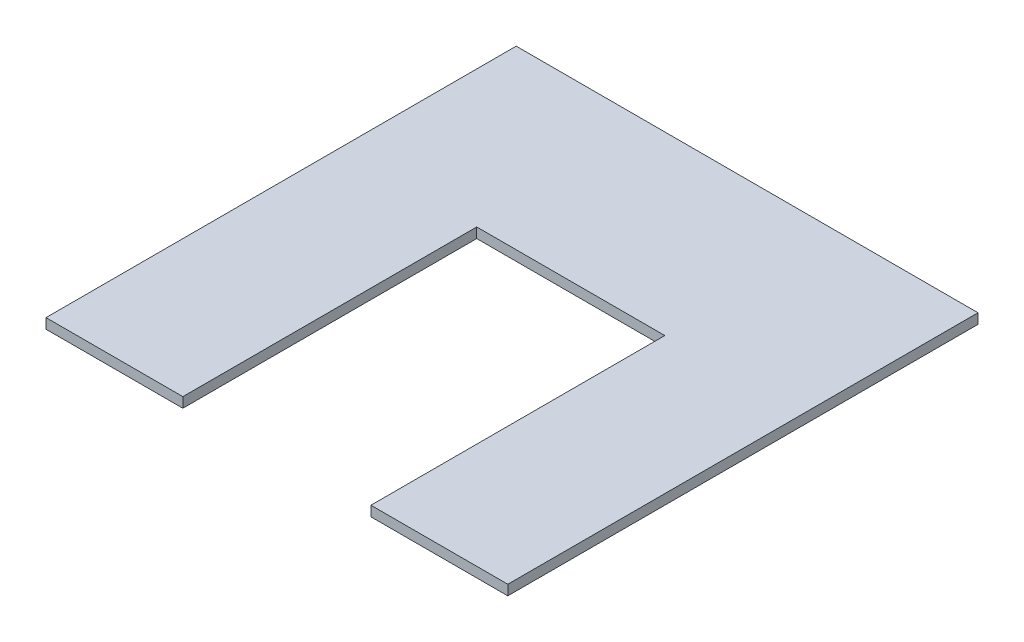
ISO-10303-21;
HEADER;
FILE_DESCRIPTION(('STEP AP214'),'2;1');
FILE_NAME('part.step','',(''),(''),'','','');
FILE_SCHEMA(('AUTOMOTIVE_DESIGN { 1 0 10303 214 1 1 1 1 }'));
ENDSEC;
DATA;
#1=APPLICATION_CONTEXT('core data for automotive mechanical design processes');
#2=APPLICATION_PROTOCOL_DEFINITION('international standard','automotive_design',2000,#1);
#3=PRODUCT_CONTEXT('',#1,'mechanical');
#4=PRODUCT('Part','Part','',(#3));
#5=PRODUCT_RELATED_PRODUCT_CATEGORY('part','',(#4));
#6=PRODUCT_DEFINITION_FORMATION('','',#4);
#7=PRODUCT_DEFINITION_CONTEXT('part definition',#1,'design');
#8=PRODUCT_DEFINITION('design','',#6,#7);
#9=PRODUCT_DEFINITION_SHAPE('','',#8);
#10=(LENGTH_UNIT() NAMED_UNIT(*) SI_UNIT(.MILLI.,.METRE.));
#11=(NAMED_UNIT(*) PLANE_ANGLE_UNIT() SI_UNIT($,.RADIAN.));
#12=(NAMED_UNIT(*) SI_UNIT($,.STERADIAN.) SOLID_ANGLE_UNIT());
#13=UNCERTAINTY_MEASURE_WITH_UNIT(LENGTH_MEASURE(1.E-05),#10,'distance_accuracy_value','');
#14=(GEOMETRIC_REPRESENTATION_CONTEXT(3) GLOBAL_UNCERTAINTY_ASSIGNED_CONTEXT((#13)) GLOBAL_UNIT_ASSIGNED_CONTEXT((#10,
#11,#12)) REPRESENTATION_CONTEXT('',''));
#15=CARTESIAN_POINT('',(0.,0.,0.));
#16=DIRECTION('',(0.,0.,1.));
#17=DIRECTION('',(1.,0.,0.));
#18=AXIS2_PLACEMENT_3D('',#15,#16,#17);
#19=CARTESIAN_POINT('',(-41.5239656937541,6.,0.));
#20=DIRECTION('',(1.,0.,0.));
#21=DIRECTION('',(0.,0.,-1.));
#22=AXIS2_PLACEMENT_3D('',#19,#20,#21);
#23=PLANE('',#22);
#24=DIRECTION('',(0.,0.,1.));
#25=VECTOR('',#24,1.);
#26=CARTESIAN_POINT('',(-41.5239656937541,0.,0.));
#27=LINE('',#26,#25);
#28=CARTESIAN_POINT('',(-41.5239656937541,0.,0.));
#29=VERTEX_POINT('',#28);
#30=CARTESIAN_POINT('',(-41.5239656937541,0.,280.));
#31=VERTEX_POINT('',#30);
#32=EDGE_CURVE('E144',#29,#31,#27,.T.);
#33=ORIENTED_EDGE('',*,*,#32,.T.);
#34=DIRECTION('',(0.,-1.,0.));
#35=VECTOR('',#34,1.);
#36=CARTESIAN_POINT('',(-41.5239656937541,6.,280.));
#37=LINE('',#36,#35);
#38=CARTESIAN_POINT('',(-41.5239656937541,6.,280.));
#39=VERTEX_POINT('',#38);
#40=EDGE_CURVE('E11',#39,#31,#37,.T.);
#41=ORIENTED_EDGE('',*,*,#40,.F.);
#42=DIRECTION('',(0.,0.,1.));
#43=VECTOR('',#42,1.);
#44=CARTESIAN_POINT('',(-41.5239656937541,6.,0.));
#45=LINE('',#44,#43);
#46=CARTESIAN_POINT('',(-41.5239656937541,6.,0.));
#47=VERTEX_POINT('',#46);
#48=EDGE_CURVE('E166',#47,#39,#45,.T.);
#49=ORIENTED_EDGE('',*,*,#48,.F.);
#50=DIRECTION('',(0.,-1.,0.));
#51=VECTOR('',#50,1.);
#52=CARTESIAN_POINT('',(-41.5239656937541,6.,0.));
#53=LINE('',#52,#51);
#54=EDGE_CURVE('E140',#47,#29,#53,.T.);
#55=ORIENTED_EDGE('',*,*,#54,.T.);
#56=EDGE_LOOP('',(#33,#41,#49,#55));
#57=FACE_BOUND('',#56,.T.);
#58=ADVANCED_FACE('F43',(#57),#23,.F.);
#59=CARTESIAN_POINT('',(-41.5239656937541,6.,280.));
#60=DIRECTION('',(0.,0.,-1.));
#61=DIRECTION('',(-1.,0.,0.));
#62=AXIS2_PLACEMENT_3D('',#59,#60,#61);
#63=PLANE('',#62);
#64=DIRECTION('',(1.,0.,0.));
#65=VECTOR('',#64,1.);
#66=CARTESIAN_POINT('',(-41.5239656937541,0.,280.));
#67=LINE('',#66,#65);
#68=CARTESIAN_POINT('',(39.9760343062459,0.,280.));
#69=VERTEX_POINT('',#68);
#70=EDGE_CURVE('E148',#31,#69,#67,.T.);
#71=ORIENTED_EDGE('',*,*,#70,.T.);
#72=DIRECTION('',(0.,-1.,0.));
#73=VECTOR('',#72,1.);
#74=CARTESIAN_POINT('',(39.9760343062459,6.,280.));
#75=LINE('',#74,#73);
#76=CARTESIAN_POINT('',(39.9760343062459,6.,280.));
#77=VERTEX_POINT('',#76);
#78=EDGE_CURVE('E52',#77,#69,#75,.T.);
#79=ORIENTED_EDGE('',*,*,#78,.F.);
#80=DIRECTION('',(1.,0.,0.));
#81=VECTOR('',#80,1.);
#82=CARTESIAN_POINT('',(-41.5239656937541,6.,280.));
#83=LINE('',#82,#81);
#84=EDGE_CURVE('E103',#39,#77,#83,.T.);
#85=ORIENTED_EDGE('',*,*,#84,.F.);
#86=ORIENTED_EDGE('',*,*,#40,.T.);
#87=EDGE_LOOP('',(#71,#79,#85,#86));
#88=FACE_BOUND('',#87,.T.);
#89=ADVANCED_FACE('F212',(#88),#63,.F.);
#90=CARTESIAN_POINT('',(39.9760343062459,6.,280.));
#91=DIRECTION('',(-1.,0.,0.));
#92=DIRECTION('',(0.,0.,1.));
#93=AXIS2_PLACEMENT_3D('',#90,#91,#92);
#94=PLANE('',#93);
#95=DIRECTION('',(0.,0.,-1.));
#96=VECTOR('',#95,1.);
#97=CARTESIAN_POINT('',(39.9760343062459,0.,280.));
#98=LINE('',#97,#96);
#99=CARTESIAN_POINT('',(39.9760343062459,0.,105.));
#100=VERTEX_POINT('',#99);
#101=EDGE_CURVE('E151',#69,#100,#98,.T.);
#102=ORIENTED_EDGE('',*,*,#101,.T.);
#103=DIRECTION('',(0.,-1.,0.));
#104=VECTOR('',#103,1.);
#105=CARTESIAN_POINT('',(39.9760343062459,6.,105.));
#106=LINE('',#105,#104);
#107=CARTESIAN_POINT('',(39.9760343062459,6.,105.));
#108=VERTEX_POINT('',#107);
#109=EDGE_CURVE('E177',#108,#100,#106,.T.);
#110=ORIENTED_EDGE('',*,*,#109,.F.);
#111=DIRECTION('',(0.,0.,-1.));
#112=VECTOR('',#111,1.);
#113=CARTESIAN_POINT('',(39.9760343062459,6.,280.));
#114=LINE('',#113,#112);
#115=EDGE_CURVE('E187',#77,#108,#114,.T.);
#116=ORIENTED_EDGE('',*,*,#115,.F.);
#117=ORIENTED_EDGE('',*,*,#78,.T.);
#118=EDGE_LOOP('',(#102,#110,#116,#117));
#119=FACE_BOUND('',#118,.T.);
#120=ADVANCED_FACE('F185',(#119),#94,.F.);
#121=CARTESIAN_POINT('',(39.9760343062459,6.,105.));
#122=DIRECTION('',(0.,0.,-1.));
#123=DIRECTION('',(-1.,0.,0.));
#124=AXIS2_PLACEMENT_3D('',#121,#122,#123);
#125=PLANE('',#124);
#126=DIRECTION('',(1.,0.,0.));
#127=VECTOR('',#126,1.);
#128=CARTESIAN_POINT('',(39.9760343062459,0.,105.));
#129=LINE('',#128,#127);
#130=CARTESIAN_POINT('',(151.976034306246,0.,105.));
#131=VERTEX_POINT('',#130);
#132=EDGE_CURVE('E154',#100,#131,#129,.T.);
#133=ORIENTED_EDGE('',*,*,#132,.T.);
#134=DIRECTION('',(0.,-1.,0.));
#135=VECTOR('',#134,1.);
#136=CARTESIAN_POINT('',(151.976034306246,6.,105.));
#137=LINE('',#136,#135);
#138=CARTESIAN_POINT('',(151.976034306246,6.,105.));
#139=VERTEX_POINT('',#138);
#140=EDGE_CURVE('E173',#139,#131,#137,.T.);
#141=ORIENTED_EDGE('',*,*,#140,.F.);
#142=DIRECTION('',(1.,0.,0.));
#143=VECTOR('',#142,1.);
#144=CARTESIAN_POINT('',(39.9760343062459,6.,105.));
#145=LINE('',#144,#143);
#146=EDGE_CURVE('E200',#108,#139,#145,.T.);
#147=ORIENTED_EDGE('',*,*,#146,.F.);
#148=ORIENTED_EDGE('',*,*,#109,.T.);
#149=EDGE_LOOP('',(#133,#141,#147,#148));
#150=FACE_BOUND('',#149,.T.);
#151=ADVANCED_FACE('F195',(#150),#125,.F.);
#152=CARTESIAN_POINT('',(151.976034306246,6.,105.));
#153=DIRECTION('',(1.,0.,0.));
#154=DIRECTION('',(0.,0.,-1.));
#155=AXIS2_PLACEMENT_3D('',#152,#153,#154);
#156=PLANE('',#155);
#157=DIRECTION('',(0.,0.,1.));
#158=VECTOR('',#157,1.);
#159=CARTESIAN_POINT('',(151.976034306246,0.,105.));
#160=LINE('',#159,#158);
#161=CARTESIAN_POINT('',(151.976034306246,0.,280.));
#162=VERTEX_POINT('',#161);
#163=EDGE_CURVE('E157',#131,#162,#160,.T.);
#164=ORIENTED_EDGE('',*,*,#163,.T.);
#165=DIRECTION('',(0.,-1.,0.));
#166=VECTOR('',#165,1.);
#167=CARTESIAN_POINT('',(151.976034306246,6.,280.));
#168=LINE('',#167,#166);
#169=CARTESIAN_POINT('',(151.976034306246,6.,280.));
#170=VERTEX_POINT('',#169);
#171=EDGE_CURVE('E133',#170,#162,#168,.T.);
#172=ORIENTED_EDGE('',*,*,#171,.F.);
#173=DIRECTION('',(0.,0.,1.));
#174=VECTOR('',#173,1.);
#175=CARTESIAN_POINT('',(151.976034306246,6.,105.));
#176=LINE('',#175,#174);
#177=EDGE_CURVE('E122',#139,#170,#176,.T.);
#178=ORIENTED_EDGE('',*,*,#177,.F.);
#179=ORIENTED_EDGE('',*,*,#140,.T.);
#180=EDGE_LOOP('',(#164,#172,#178,#179));
#181=FACE_BOUND('',#180,.T.);
#182=ADVANCED_FACE('F198',(#181),#156,.F.);
#183=CARTESIAN_POINT('',(151.976034306246,6.,280.));
#184=DIRECTION('',(0.,0.,-1.));
#185=DIRECTION('',(-1.,0.,0.));
#186=AXIS2_PLACEMENT_3D('',#183,#184,#185);
#187=PLANE('',#186);
#188=DIRECTION('',(1.,0.,0.));
#189=VECTOR('',#188,1.);
#190=CARTESIAN_POINT('',(151.976034306246,0.,280.));
#191=LINE('',#190,#189);
#192=CARTESIAN_POINT('',(233.476034306246,0.,280.));
#193=VERTEX_POINT('',#192);
#194=EDGE_CURVE('E131',#162,#193,#191,.T.);
#195=ORIENTED_EDGE('',*,*,#194,.T.);
#196=DIRECTION('',(0.,-1.,0.));
#197=VECTOR('',#196,1.);
#198=CARTESIAN_POINT('',(233.476034306246,6.,280.));
#199=LINE('',#198,#197);
#200=CARTESIAN_POINT('',(233.476034306246,6.,280.));
#201=VERTEX_POINT('',#200);
#202=EDGE_CURVE('E128',#201,#193,#199,.T.);
#203=ORIENTED_EDGE('',*,*,#202,.F.);
#204=DIRECTION('',(1.,0.,0.));
#205=VECTOR('',#204,1.);
#206=CARTESIAN_POINT('',(151.976034306246,6.,280.));
#207=LINE('',#206,#205);
#208=EDGE_CURVE('E116',#170,#201,#207,.T.);
#209=ORIENTED_EDGE('',*,*,#208,.F.);
#210=ORIENTED_EDGE('',*,*,#171,.T.);
#211=EDGE_LOOP('',(#195,#203,#209,#210));
#212=FACE_BOUND('',#211,.T.);
#213=ADVANCED_FACE('F129',(#212),#187,.F.);
#214=CARTESIAN_POINT('',(233.476034306246,6.,0.));
#215=DIRECTION('',(-1.,0.,0.));
#216=DIRECTION('',(0.,0.,1.));
#217=AXIS2_PLACEMENT_3D('',#214,#215,#216);
#218=PLANE('',#217);
#219=DIRECTION('',(0.,0.,-1.));
#220=VECTOR('',#219,1.);
#221=CARTESIAN_POINT('',(233.476034306246,0.,0.));
#222=LINE('',#221,#220);
#223=CARTESIAN_POINT('',(233.476034306246,0.,0.));
#224=VERTEX_POINT('',#223);
#225=EDGE_CURVE('E89',#193,#224,#222,.T.);
#226=ORIENTED_EDGE('',*,*,#225,.T.);
#227=DIRECTION('',(0.,-1.,0.));
#228=VECTOR('',#227,1.);
#229=CARTESIAN_POINT('',(233.476034306246,6.,0.));
#230=LINE('',#229,#228);
#231=CARTESIAN_POINT('',(233.476034306246,6.,0.));
#232=VERTEX_POINT('',#231);
#233=EDGE_CURVE('E134',#232,#224,#230,.T.);
#234=ORIENTED_EDGE('',*,*,#233,.F.);
#235=DIRECTION('',(0.,0.,-1.));
#236=VECTOR('',#235,1.);
#237=CARTESIAN_POINT('',(233.476034306246,6.,0.));
#238=LINE('',#237,#236);
#239=EDGE_CURVE('E120',#201,#232,#238,.T.);
#240=ORIENTED_EDGE('',*,*,#239,.F.);
#241=ORIENTED_EDGE('',*,*,#202,.T.);
#242=EDGE_LOOP('',(#226,#234,#240,#241));
#243=FACE_BOUND('',#242,.T.);
#244=ADVANCED_FACE('F136',(#243),#218,.F.);
#245=CARTESIAN_POINT('',(-41.5239656937541,6.,0.));
#246=DIRECTION('',(0.,0.,1.));
#247=DIRECTION('',(1.,0.,0.));
#248=AXIS2_PLACEMENT_3D('',#245,#246,#247);
#249=PLANE('',#248);
#250=DIRECTION('',(-1.,0.,0.));
#251=VECTOR('',#250,1.);
#252=CARTESIAN_POINT('',(-41.5239656937541,0.,0.));
#253=LINE('',#252,#251);
#254=EDGE_CURVE('E95',#224,#29,#253,.T.);
#255=ORIENTED_EDGE('',*,*,#254,.T.);
#256=ORIENTED_EDGE('',*,*,#54,.F.);
#257=DIRECTION('',(-1.,0.,0.));
#258=VECTOR('',#257,1.);
#259=CARTESIAN_POINT('',(-41.5239656937541,6.,0.));
#260=LINE('',#259,#258);
#261=EDGE_CURVE('E60',#232,#47,#260,.T.);
#262=ORIENTED_EDGE('',*,*,#261,.F.);
#263=ORIENTED_EDGE('',*,*,#233,.T.);
#264=EDGE_LOOP('',(#255,#256,#262,#263));
#265=FACE_BOUND('',#264,.T.);
#266=ADVANCED_FACE('F228',(#265),#249,.F.);
#267=CARTESIAN_POINT('',(0.,6.,0.));
#268=DIRECTION('',(0.,1.,0.));
#269=DIRECTION('',(0.,0.,1.));
#270=AXIS2_PLACEMENT_3D('',#267,#268,#269);
#271=PLANE('',#270);
#272=ORIENTED_EDGE('',*,*,#48,.T.);
#273=ORIENTED_EDGE('',*,*,#84,.T.);
#274=ORIENTED_EDGE('',*,*,#115,.T.);
#275=ORIENTED_EDGE('',*,*,#146,.T.);
#276=ORIENTED_EDGE('',*,*,#177,.T.);
#277=ORIENTED_EDGE('',*,*,#208,.T.);
#278=ORIENTED_EDGE('',*,*,#239,.T.);
#279=ORIENTED_EDGE('',*,*,#261,.T.);
#280=EDGE_LOOP('',(#272,#273,#274,#275,#276,#277,#278,#279));
#281=FACE_BOUND('',#280,.T.);
#282=ADVANCED_FACE('F118',(#281),#271,.T.);
#283=CARTESIAN_POINT('',(0.,0.,0.));
#284=DIRECTION('',(0.,1.,0.));
#285=DIRECTION('',(0.,0.,1.));
#286=AXIS2_PLACEMENT_3D('',#283,#284,#285);
#287=PLANE('',#286);
#288=ORIENTED_EDGE('',*,*,#32,.F.);
#289=ORIENTED_EDGE('',*,*,#254,.F.);
#290=ORIENTED_EDGE('',*,*,#225,.F.);
#291=ORIENTED_EDGE('',*,*,#194,.F.);
#292=ORIENTED_EDGE('',*,*,#163,.F.);
#293=ORIENTED_EDGE('',*,*,#132,.F.);
#294=ORIENTED_EDGE('',*,*,#101,.F.);
#295=ORIENTED_EDGE('',*,*,#70,.F.);
#296=EDGE_LOOP('',(#288,#289,#290,#291,#292,#293,#294,#295));
#297=FACE_BOUND('',#296,.T.);
#298=ADVANCED_FACE('F191',(#297),#287,.F.);
#299=CLOSED_SHELL('',(#58,#89,#120,#151,#182,#213,#244,#266,#282,#298));
#300=MANIFOLD_SOLID_BREP('B2',#299);
#301=ADVANCED_BREP_SHAPE_REPRESENTATION('',(#18,#300),#14);
#302=SHAPE_DEFINITION_REPRESENTATION(#9,#301);
ENDSEC;
END-ISO-10303-21;
